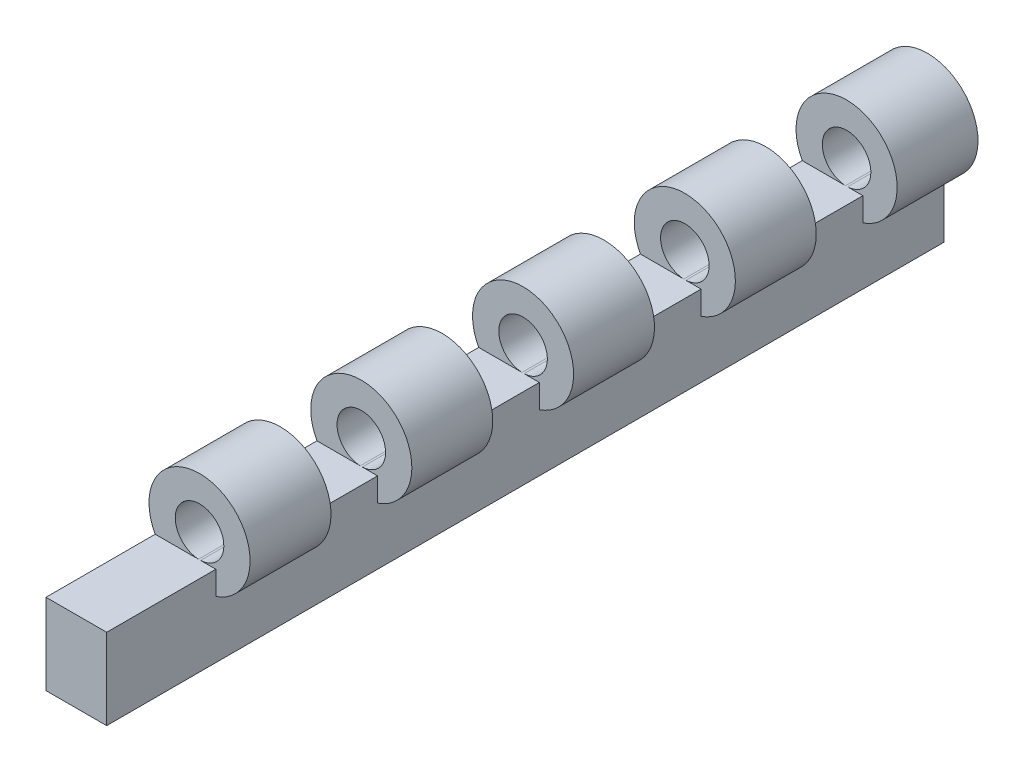
ISO-10303-21;
HEADER;
FILE_DESCRIPTION(('STEP AP214'),'2;1');
FILE_NAME('part.step','',(''),(''),'','','');
FILE_SCHEMA(('AUTOMOTIVE_DESIGN { 1 0 10303 214 1 1 1 1 }'));
ENDSEC;
DATA;
#1=APPLICATION_CONTEXT('core data for automotive mechanical design processes');
#2=APPLICATION_PROTOCOL_DEFINITION('international standard','automotive_design',2000,#1);
#3=PRODUCT_CONTEXT('',#1,'mechanical');
#4=PRODUCT('Part','Part','',(#3));
#5=PRODUCT_RELATED_PRODUCT_CATEGORY('part','',(#4));
#6=PRODUCT_DEFINITION_FORMATION('','',#4);
#7=PRODUCT_DEFINITION_CONTEXT('part definition',#1,'design');
#8=PRODUCT_DEFINITION('design','',#6,#7);
#9=PRODUCT_DEFINITION_SHAPE('','',#8);
#10=(LENGTH_UNIT() NAMED_UNIT(*) SI_UNIT(.MILLI.,.METRE.));
#11=(NAMED_UNIT(*) PLANE_ANGLE_UNIT() SI_UNIT($,.RADIAN.));
#12=(NAMED_UNIT(*) SI_UNIT($,.STERADIAN.) SOLID_ANGLE_UNIT());
#13=UNCERTAINTY_MEASURE_WITH_UNIT(LENGTH_MEASURE(1.E-05),#10,'distance_accuracy_value','');
#14=(GEOMETRIC_REPRESENTATION_CONTEXT(3) GLOBAL_UNCERTAINTY_ASSIGNED_CONTEXT((#13)) GLOBAL_UNIT_ASSIGNED_CONTEXT((#10,
#11,#12)) REPRESENTATION_CONTEXT('',''));
#15=CARTESIAN_POINT('',(0.,0.,0.));
#16=DIRECTION('',(0.,0.,1.));
#17=DIRECTION('',(1.,0.,0.));
#18=AXIS2_PLACEMENT_3D('',#15,#16,#17);
#19=CARTESIAN_POINT('',(0.,20.,0.));
#20=DIRECTION('',(0.,1.,0.));
#21=DIRECTION('',(0.,0.,-1.));
#22=AXIS2_PLACEMENT_3D('',#19,#20,#21);
#23=PLANE('',#22);
#24=DIRECTION('',(0.,0.,-1.));
#25=VECTOR('',#24,1.);
#26=CARTESIAN_POINT('',(0.,20.,103.5));
#27=LINE('',#26,#25);
#28=CARTESIAN_POINT('',(0.,20.,103.5));
#29=VERTEX_POINT('',#28);
#30=CARTESIAN_POINT('',(0.,20.,76.5));
#31=VERTEX_POINT('',#30);
#32=EDGE_CURVE('E274',#29,#31,#27,.T.);
#33=ORIENTED_EDGE('',*,*,#32,.F.);
#34=DIRECTION('',(-1.,0.,0.));
#35=VECTOR('',#34,1.);
#36=CARTESIAN_POINT('',(0.,20.,103.5));
#37=LINE('',#36,#35);
#38=CARTESIAN_POINT('',(15.,20.,103.5));
#39=VERTEX_POINT('',#38);
#40=EDGE_CURVE('E292',#39,#29,#37,.T.);
#41=ORIENTED_EDGE('',*,*,#40,.F.);
#42=DIRECTION('',(0.,0.,1.));
#43=VECTOR('',#42,1.);
#44=CARTESIAN_POINT('',(15.,20.,103.5));
#45=LINE('',#44,#43);
#46=CARTESIAN_POINT('',(15.,20.,76.5));
#47=VERTEX_POINT('',#46);
#48=EDGE_CURVE('E277',#47,#39,#45,.T.);
#49=ORIENTED_EDGE('',*,*,#48,.F.);
#50=DIRECTION('',(1.,0.,0.));
#51=VECTOR('',#50,1.);
#52=CARTESIAN_POINT('',(0.,20.,76.5));
#53=LINE('',#52,#51);
#54=CARTESIAN_POINT('',(11.2318391123888,20.,76.5));
#55=VERTEX_POINT('',#54);
#56=EDGE_CURVE('E233',#55,#47,#53,.T.);
#57=ORIENTED_EDGE('',*,*,#56,.F.);
#58=DIRECTION('',(0.,0.,-1.));
#59=VECTOR('',#58,1.);
#60=CARTESIAN_POINT('',(11.2318391123888,20.,76.5));
#61=LINE('',#60,#59);
#62=CARTESIAN_POINT('',(11.2318391123888,20.,56.5));
#63=VERTEX_POINT('',#62);
#64=EDGE_CURVE('E43',#63,#55,#61,.F.);
#65=ORIENTED_EDGE('',*,*,#64,.F.);
#66=DIRECTION('',(1.,0.,0.));
#67=VECTOR('',#66,1.);
#68=CARTESIAN_POINT('',(0.,20.,56.5));
#69=LINE('',#68,#67);
#70=CARTESIAN_POINT('',(15.,20.,56.5));
#71=VERTEX_POINT('',#70);
#72=EDGE_CURVE('E221',#63,#71,#69,.T.);
#73=ORIENTED_EDGE('',*,*,#72,.T.);
#74=CARTESIAN_POINT('',(15.,20.,36.5));
#75=VERTEX_POINT('',#74);
#76=EDGE_CURVE('E415',#75,#71,#45,.T.);
#77=ORIENTED_EDGE('',*,*,#76,.F.);
#78=DIRECTION('',(1.,0.,0.));
#79=VECTOR('',#78,1.);
#80=CARTESIAN_POINT('',(0.,20.,36.5));
#81=LINE('',#80,#79);
#82=CARTESIAN_POINT('',(11.2318391123888,20.,36.5));
#83=VERTEX_POINT('',#82);
#84=EDGE_CURVE('E366',#83,#75,#81,.T.);
#85=ORIENTED_EDGE('',*,*,#84,.F.);
#86=DIRECTION('',(0.,0.,-1.));
#87=VECTOR('',#86,1.);
#88=CARTESIAN_POINT('',(11.2318391123888,20.,36.5));
#89=LINE('',#88,#87);
#90=CARTESIAN_POINT('',(11.2318391123888,20.,16.5));
#91=VERTEX_POINT('',#90);
#92=EDGE_CURVE('E236',#91,#83,#89,.F.);
#93=ORIENTED_EDGE('',*,*,#92,.F.);
#94=DIRECTION('',(1.,0.,0.));
#95=VECTOR('',#94,1.);
#96=CARTESIAN_POINT('',(0.,20.,16.5));
#97=LINE('',#96,#95);
#98=CARTESIAN_POINT('',(15.,20.,16.5));
#99=VERTEX_POINT('',#98);
#100=EDGE_CURVE('E372',#91,#99,#97,.T.);
#101=ORIENTED_EDGE('',*,*,#100,.T.);
#102=CARTESIAN_POINT('',(15.,20.,-3.49999999999999));
#103=VERTEX_POINT('',#102);
#104=EDGE_CURVE('E416',#103,#99,#45,.T.);
#105=ORIENTED_EDGE('',*,*,#104,.F.);
#106=DIRECTION('',(1.,0.,0.));
#107=VECTOR('',#106,1.);
#108=CARTESIAN_POINT('',(0.,20.,-3.49999999999999));
#109=LINE('',#108,#107);
#110=CARTESIAN_POINT('',(11.2318391123888,20.,-3.49999999999999));
#111=VERTEX_POINT('',#110);
#112=EDGE_CURVE('E343',#111,#103,#109,.T.);
#113=ORIENTED_EDGE('',*,*,#112,.F.);
#114=DIRECTION('',(0.,0.,-1.));
#115=VECTOR('',#114,1.);
#116=CARTESIAN_POINT('',(11.2318391123888,20.,-3.49999999999999));
#117=LINE('',#116,#115);
#118=CARTESIAN_POINT('',(11.2318391123888,20.,-23.5));
#119=VERTEX_POINT('',#118);
#120=EDGE_CURVE('E244',#119,#111,#117,.F.);
#121=ORIENTED_EDGE('',*,*,#120,.F.);
#122=DIRECTION('',(1.,0.,0.));
#123=VECTOR('',#122,1.);
#124=CARTESIAN_POINT('',(0.,20.,-23.5));
#125=LINE('',#124,#123);
#126=CARTESIAN_POINT('',(15.,20.,-23.5));
#127=VERTEX_POINT('',#126);
#128=EDGE_CURVE('E349',#119,#127,#125,.T.);
#129=ORIENTED_EDGE('',*,*,#128,.T.);
#130=CARTESIAN_POINT('',(15.,20.,-43.5));
#131=VERTEX_POINT('',#130);
#132=EDGE_CURVE('E298',#131,#127,#45,.T.);
#133=ORIENTED_EDGE('',*,*,#132,.F.);
#134=DIRECTION('',(1.,0.,0.));
#135=VECTOR('',#134,1.);
#136=CARTESIAN_POINT('',(0.,20.,-43.5));
#137=LINE('',#136,#135);
#138=CARTESIAN_POINT('',(11.2318391123888,20.,-43.5));
#139=VERTEX_POINT('',#138);
#140=EDGE_CURVE('E320',#139,#131,#137,.T.);
#141=ORIENTED_EDGE('',*,*,#140,.F.);
#142=DIRECTION('',(0.,0.,-1.));
#143=VECTOR('',#142,1.);
#144=CARTESIAN_POINT('',(11.2318391123888,20.,-43.5));
#145=LINE('',#144,#143);
#146=CARTESIAN_POINT('',(11.2318391123888,20.,-63.5));
#147=VERTEX_POINT('',#146);
#148=EDGE_CURVE('E250',#147,#139,#145,.F.);
#149=ORIENTED_EDGE('',*,*,#148,.F.);
#150=DIRECTION('',(1.,0.,0.));
#151=VECTOR('',#150,1.);
#152=CARTESIAN_POINT('',(0.,20.,-63.5));
#153=LINE('',#152,#151);
#154=CARTESIAN_POINT('',(15.,20.,-63.5));
#155=VERTEX_POINT('',#154);
#156=EDGE_CURVE('E326',#147,#155,#153,.T.);
#157=ORIENTED_EDGE('',*,*,#156,.T.);
#158=CARTESIAN_POINT('',(15.,20.,-83.5));
#159=VERTEX_POINT('',#158);
#160=EDGE_CURVE('E295',#159,#155,#45,.T.);
#161=ORIENTED_EDGE('',*,*,#160,.F.);
#162=DIRECTION('',(1.,0.,0.));
#163=VECTOR('',#162,1.);
#164=CARTESIAN_POINT('',(0.,20.,-83.5));
#165=LINE('',#164,#163);
#166=CARTESIAN_POINT('',(11.2318391123888,20.,-83.5));
#167=VERTEX_POINT('',#166);
#168=EDGE_CURVE('E257',#167,#159,#165,.T.);
#169=ORIENTED_EDGE('',*,*,#168,.F.);
#170=DIRECTION('',(0.,0.,-1.));
#171=VECTOR('',#170,1.);
#172=CARTESIAN_POINT('',(11.2318391123888,20.,-83.5));
#173=LINE('',#172,#171);
#174=CARTESIAN_POINT('',(11.2318391123888,20.,-103.5));
#175=VERTEX_POINT('',#174);
#176=EDGE_CURVE('E261',#175,#167,#173,.F.);
#177=ORIENTED_EDGE('',*,*,#176,.F.);
#178=DIRECTION('',(1.,0.,0.));
#179=VECTOR('',#178,1.);
#180=CARTESIAN_POINT('',(0.,20.,-103.5));
#181=LINE('',#180,#179);
#182=CARTESIAN_POINT('',(10.7061718741469,20.,-103.5));
#183=VERTEX_POINT('',#182);
#184=EDGE_CURVE('E253',#183,#175,#181,.T.);
#185=ORIENTED_EDGE('',*,*,#184,.F.);
#186=DIRECTION('',(0.,0.,-1.));
#187=VECTOR('',#186,1.);
#188=CARTESIAN_POINT('',(10.7061718741469,20.,-83.5));
#189=LINE('',#188,#187);
#190=CARTESIAN_POINT('',(10.7061718741469,20.,-83.5));
#191=VERTEX_POINT('',#190);
#192=EDGE_CURVE('E260',#191,#183,#189,.T.);
#193=ORIENTED_EDGE('',*,*,#192,.F.);
#194=CARTESIAN_POINT('',(0.,20.,-83.5));
#195=VERTEX_POINT('',#194);
#196=EDGE_CURVE('E256',#195,#191,#165,.T.);
#197=ORIENTED_EDGE('',*,*,#196,.F.);
#198=CARTESIAN_POINT('',(0.,20.,-63.5));
#199=VERTEX_POINT('',#198);
#200=EDGE_CURVE('E471',#199,#195,#27,.T.);
#201=ORIENTED_EDGE('',*,*,#200,.F.);
#202=CARTESIAN_POINT('',(10.7061718741469,20.,-63.5));
#203=VERTEX_POINT('',#202);
#204=EDGE_CURVE('E325',#199,#203,#153,.T.);
#205=ORIENTED_EDGE('',*,*,#204,.T.);
#206=DIRECTION('',(0.,0.,-1.));
#207=VECTOR('',#206,1.);
#208=CARTESIAN_POINT('',(10.7061718741469,20.,-43.5));
#209=LINE('',#208,#207);
#210=CARTESIAN_POINT('',(10.7061718741469,20.,-43.5));
#211=VERTEX_POINT('',#210);
#212=EDGE_CURVE('E247',#211,#203,#209,.T.);
#213=ORIENTED_EDGE('',*,*,#212,.F.);
#214=CARTESIAN_POINT('',(0.,20.,-43.5));
#215=VERTEX_POINT('',#214);
#216=EDGE_CURVE('E319',#215,#211,#137,.T.);
#217=ORIENTED_EDGE('',*,*,#216,.F.);
#218=CARTESIAN_POINT('',(0.,20.,-23.5));
#219=VERTEX_POINT('',#218);
#220=EDGE_CURVE('E470',#219,#215,#27,.T.);
#221=ORIENTED_EDGE('',*,*,#220,.F.);
#222=CARTESIAN_POINT('',(10.7061718741469,20.,-23.5));
#223=VERTEX_POINT('',#222);
#224=EDGE_CURVE('E348',#219,#223,#125,.T.);
#225=ORIENTED_EDGE('',*,*,#224,.T.);
#226=DIRECTION('',(0.,0.,-1.));
#227=VECTOR('',#226,1.);
#228=CARTESIAN_POINT('',(10.7061718741469,20.,-3.49999999999999));
#229=LINE('',#228,#227);
#230=CARTESIAN_POINT('',(10.7061718741469,20.,-3.49999999999999));
#231=VERTEX_POINT('',#230);
#232=EDGE_CURVE('E241',#231,#223,#229,.T.);
#233=ORIENTED_EDGE('',*,*,#232,.F.);
#234=CARTESIAN_POINT('',(0.,20.,-3.49999999999999));
#235=VERTEX_POINT('',#234);
#236=EDGE_CURVE('E342',#235,#231,#109,.T.);
#237=ORIENTED_EDGE('',*,*,#236,.F.);
#238=CARTESIAN_POINT('',(0.,20.,16.5));
#239=VERTEX_POINT('',#238);
#240=EDGE_CURVE('E408',#239,#235,#27,.T.);
#241=ORIENTED_EDGE('',*,*,#240,.F.);
#242=CARTESIAN_POINT('',(10.7061718741469,20.,16.5));
#243=VERTEX_POINT('',#242);
#244=EDGE_CURVE('E371',#239,#243,#97,.T.);
#245=ORIENTED_EDGE('',*,*,#244,.T.);
#246=DIRECTION('',(0.,0.,-1.));
#247=VECTOR('',#246,1.);
#248=CARTESIAN_POINT('',(10.7061718741469,20.,36.5));
#249=LINE('',#248,#247);
#250=CARTESIAN_POINT('',(10.7061718741469,20.,36.5));
#251=VERTEX_POINT('',#250);
#252=EDGE_CURVE('E234',#251,#243,#249,.T.);
#253=ORIENTED_EDGE('',*,*,#252,.F.);
#254=CARTESIAN_POINT('',(0.,20.,36.5));
#255=VERTEX_POINT('',#254);
#256=EDGE_CURVE('E365',#255,#251,#81,.T.);
#257=ORIENTED_EDGE('',*,*,#256,.F.);
#258=CARTESIAN_POINT('',(0.,20.,56.5));
#259=VERTEX_POINT('',#258);
#260=EDGE_CURVE('E290',#259,#255,#27,.T.);
#261=ORIENTED_EDGE('',*,*,#260,.F.);
#262=CARTESIAN_POINT('',(10.7061718741469,20.,56.5));
#263=VERTEX_POINT('',#262);
#264=EDGE_CURVE('E228',#259,#263,#69,.T.);
#265=ORIENTED_EDGE('',*,*,#264,.T.);
#266=DIRECTION('',(0.,0.,-1.));
#267=VECTOR('',#266,1.);
#268=CARTESIAN_POINT('',(10.7061718741469,20.,76.5));
#269=LINE('',#268,#267);
#270=CARTESIAN_POINT('',(10.7061718741469,20.,76.5));
#271=VERTEX_POINT('',#270);
#272=EDGE_CURVE('E11',#271,#263,#269,.T.);
#273=ORIENTED_EDGE('',*,*,#272,.F.);
#274=EDGE_CURVE('E388',#31,#271,#53,.T.);
#275=ORIENTED_EDGE('',*,*,#274,.F.);
#276=EDGE_LOOP('',(#33,#41,#49,#57,#65,#73,#77,#85,#93,#101,#105,#113,#121,#129,#133,#141,#149,
#157,#161,#169,#177,#185,#193,#197,#201,#205,#213,#217,#221,#225,#233,#237,#241,#245,#253,#257,
#261,#265,#273,#275));
#277=FACE_BOUND('',#276,.T.);
#278=ADVANCED_FACE('F35',(#277),#23,.T.);
#279=CARTESIAN_POINT('',(15.,20.,103.5));
#280=DIRECTION('',(-1.,0.,0.));
#281=DIRECTION('',(0.,0.,-1.));
#282=AXIS2_PLACEMENT_3D('',#279,#280,#281);
#283=PLANE('',#282);
#284=DIRECTION('',(0.,1.,0.));
#285=VECTOR('',#284,1.);
#286=CARTESIAN_POINT('',(15.,20.,76.5));
#287=LINE('',#286,#285);
#288=CARTESIAN_POINT('',(15.,14.1620350996849,76.5));
#289=VERTEX_POINT('',#288);
#290=EDGE_CURVE('E390',#289,#47,#287,.T.);
#291=ORIENTED_EDGE('',*,*,#290,.T.);
#292=ORIENTED_EDGE('',*,*,#48,.T.);
#293=DIRECTION('',(0.,-1.,0.));
#294=VECTOR('',#293,1.);
#295=CARTESIAN_POINT('',(15.,20.,103.5));
#296=LINE('',#295,#294);
#297=CARTESIAN_POINT('',(15.,0.,103.5));
#298=VERTEX_POINT('',#297);
#299=EDGE_CURVE('E265',#39,#298,#296,.T.);
#300=ORIENTED_EDGE('',*,*,#299,.T.);
#301=DIRECTION('',(0.,0.,1.));
#302=VECTOR('',#301,1.);
#303=CARTESIAN_POINT('',(15.,0.,103.5));
#304=LINE('',#303,#302);
#305=CARTESIAN_POINT('',(15.,0.,-103.5));
#306=VERTEX_POINT('',#305);
#307=EDGE_CURVE('E281',#306,#298,#304,.T.);
#308=ORIENTED_EDGE('',*,*,#307,.F.);
#309=DIRECTION('',(0.,-1.,0.));
#310=VECTOR('',#309,1.);
#311=CARTESIAN_POINT('',(15.,20.,-103.5));
#312=LINE('',#311,#310);
#313=CARTESIAN_POINT('',(15.,14.1620350996849,-103.5));
#314=VERTEX_POINT('',#313);
#315=EDGE_CURVE('E262',#314,#306,#312,.T.);
#316=ORIENTED_EDGE('',*,*,#315,.F.);
#317=DIRECTION('',(0.,0.,-1.));
#318=VECTOR('',#317,1.);
#319=CARTESIAN_POINT('',(15.,14.1620350996849,-83.5));
#320=LINE('',#319,#318);
#321=CARTESIAN_POINT('',(15.,14.1620350996849,-83.5));
#322=VERTEX_POINT('',#321);
#323=EDGE_CURVE('E286',#322,#314,#320,.T.);
#324=ORIENTED_EDGE('',*,*,#323,.F.);
#325=DIRECTION('',(0.,1.,0.));
#326=VECTOR('',#325,1.);
#327=CARTESIAN_POINT('',(15.,20.,-83.5));
#328=LINE('',#327,#326);
#329=EDGE_CURVE('E309',#322,#159,#328,.T.);
#330=ORIENTED_EDGE('',*,*,#329,.T.);
#331=ORIENTED_EDGE('',*,*,#160,.T.);
#332=DIRECTION('',(0.,1.,0.));
#333=VECTOR('',#332,1.);
#334=CARTESIAN_POINT('',(15.,20.,-63.5));
#335=LINE('',#334,#333);
#336=CARTESIAN_POINT('',(15.,14.1620350996849,-63.5));
#337=VERTEX_POINT('',#336);
#338=EDGE_CURVE('E329',#337,#155,#335,.T.);
#339=ORIENTED_EDGE('',*,*,#338,.F.);
#340=DIRECTION('',(0.,0.,-1.));
#341=VECTOR('',#340,1.);
#342=CARTESIAN_POINT('',(15.,14.1620350996849,-43.5));
#343=LINE('',#342,#341);
#344=CARTESIAN_POINT('',(15.,14.1620350996849,-43.5));
#345=VERTEX_POINT('',#344);
#346=EDGE_CURVE('E302',#345,#337,#343,.T.);
#347=ORIENTED_EDGE('',*,*,#346,.F.);
#348=DIRECTION('',(0.,1.,0.));
#349=VECTOR('',#348,1.);
#350=CARTESIAN_POINT('',(15.,20.,-43.5));
#351=LINE('',#350,#349);
#352=EDGE_CURVE('E323',#345,#131,#351,.T.);
#353=ORIENTED_EDGE('',*,*,#352,.T.);
#354=ORIENTED_EDGE('',*,*,#132,.T.);
#355=DIRECTION('',(0.,1.,0.));
#356=VECTOR('',#355,1.);
#357=CARTESIAN_POINT('',(15.,20.,-23.5));
#358=LINE('',#357,#356);
#359=CARTESIAN_POINT('',(15.,14.1620350996849,-23.5));
#360=VERTEX_POINT('',#359);
#361=EDGE_CURVE('E352',#360,#127,#358,.T.);
#362=ORIENTED_EDGE('',*,*,#361,.F.);
#363=DIRECTION('',(0.,0.,-1.));
#364=VECTOR('',#363,1.);
#365=CARTESIAN_POINT('',(15.,14.1620350996849,-3.49999999999999));
#366=LINE('',#365,#364);
#367=CARTESIAN_POINT('',(15.,14.1620350996849,-3.49999999999999));
#368=VERTEX_POINT('',#367);
#369=EDGE_CURVE('E338',#368,#360,#366,.T.);
#370=ORIENTED_EDGE('',*,*,#369,.F.);
#371=DIRECTION('',(0.,1.,0.));
#372=VECTOR('',#371,1.);
#373=CARTESIAN_POINT('',(15.,20.,-3.49999999999999));
#374=LINE('',#373,#372);
#375=EDGE_CURVE('E346',#368,#103,#374,.T.);
#376=ORIENTED_EDGE('',*,*,#375,.T.);
#377=ORIENTED_EDGE('',*,*,#104,.T.);
#378=DIRECTION('',(0.,1.,0.));
#379=VECTOR('',#378,1.);
#380=CARTESIAN_POINT('',(15.,20.,16.5));
#381=LINE('',#380,#379);
#382=CARTESIAN_POINT('',(15.,14.1620350996849,16.5));
#383=VERTEX_POINT('',#382);
#384=EDGE_CURVE('E375',#383,#99,#381,.T.);
#385=ORIENTED_EDGE('',*,*,#384,.F.);
#386=DIRECTION('',(0.,0.,-1.));
#387=VECTOR('',#386,1.);
#388=CARTESIAN_POINT('',(15.,14.1620350996849,36.5));
#389=LINE('',#388,#387);
#390=CARTESIAN_POINT('',(15.,14.1620350996849,36.5));
#391=VERTEX_POINT('',#390);
#392=EDGE_CURVE('E361',#391,#383,#389,.T.);
#393=ORIENTED_EDGE('',*,*,#392,.F.);
#394=DIRECTION('',(0.,1.,0.));
#395=VECTOR('',#394,1.);
#396=CARTESIAN_POINT('',(15.,20.,36.5));
#397=LINE('',#396,#395);
#398=EDGE_CURVE('E369',#391,#75,#397,.T.);
#399=ORIENTED_EDGE('',*,*,#398,.T.);
#400=ORIENTED_EDGE('',*,*,#76,.T.);
#401=DIRECTION('',(0.,1.,0.));
#402=VECTOR('',#401,1.);
#403=CARTESIAN_POINT('',(15.,20.,56.5));
#404=LINE('',#403,#402);
#405=CARTESIAN_POINT('',(15.,14.1620350996849,56.5));
#406=VERTEX_POINT('',#405);
#407=EDGE_CURVE('E224',#406,#71,#404,.T.);
#408=ORIENTED_EDGE('',*,*,#407,.F.);
#409=DIRECTION('',(0.,0.,-1.));
#410=VECTOR('',#409,1.);
#411=CARTESIAN_POINT('',(15.,14.1620350996849,76.5));
#412=LINE('',#411,#410);
#413=EDGE_CURVE('E384',#289,#406,#412,.T.);
#414=ORIENTED_EDGE('',*,*,#413,.F.);
#415=EDGE_LOOP('',(#291,#292,#300,#308,#316,#324,#330,#331,#339,#347,#353,#354,#362,#370,#376,
#377,#385,#393,#399,#400,#408,#414));
#416=FACE_BOUND('',#415,.T.);
#417=ADVANCED_FACE('F423',(#416),#283,.F.);
#418=CARTESIAN_POINT('',(15.,20.,-103.5));
#419=DIRECTION('',(0.,0.,1.));
#420=DIRECTION('',(-1.,0.,0.));
#421=AXIS2_PLACEMENT_3D('',#418,#419,#420);
#422=PLANE('',#421);
#423=ORIENTED_EDGE('',*,*,#315,.T.);
#424=DIRECTION('',(1.,0.,0.));
#425=VECTOR('',#424,1.);
#426=CARTESIAN_POINT('',(15.,0.,-103.5));
#427=LINE('',#426,#425);
#428=CARTESIAN_POINT('',(0.,0.,-103.5));
#429=VERTEX_POINT('',#428);
#430=EDGE_CURVE('E284',#429,#306,#427,.T.);
#431=ORIENTED_EDGE('',*,*,#430,.F.);
#432=DIRECTION('',(0.,-1.,0.));
#433=VECTOR('',#432,1.);
#434=CARTESIAN_POINT('',(0.,20.,-103.5));
#435=LINE('',#434,#433);
#436=CARTESIAN_POINT('',(0.,20.,-103.5));
#437=VERTEX_POINT('',#436);
#438=EDGE_CURVE('E271',#437,#429,#435,.T.);
#439=ORIENTED_EDGE('',*,*,#438,.F.);
#440=CARTESIAN_POINT('',(10.9690054932678,25.9942404430136,-103.5));
#441=DIRECTION('',(0.,0.,1.));
#442=DIRECTION('',(1.,0.,0.));
#443=AXIS2_PLACEMENT_3D('',#440,#441,#442);
#444=CIRCLE('',#443,12.5);
#445=EDGE_CURVE('E312',#314,#437,#444,.T.);
#446=ORIENTED_EDGE('',*,*,#445,.F.);
#447=EDGE_LOOP('',(#423,#431,#439,#446));
#448=FACE_BOUND('',#447,.T.);
#449=ORIENTED_EDGE('',*,*,#184,.T.);
#450=CARTESIAN_POINT('',(10.9690054932678,25.9942404430136,-103.5));
#451=DIRECTION('',(0.,0.,1.));
#452=DIRECTION('',(1.,0.,0.));
#453=AXIS2_PLACEMENT_3D('',#450,#451,#452);
#454=CIRCLE('',#453,6.);
#455=EDGE_CURVE('E299',#175,#183,#454,.T.);
#456=ORIENTED_EDGE('',*,*,#455,.T.);
#457=EDGE_LOOP('',(#449,#456));
#458=FACE_BOUND('',#457,.T.);
#459=ADVANCED_FACE('F37',(#448,#458),#422,.F.);
#460=CARTESIAN_POINT('',(0.,20.,103.5));
#461=DIRECTION('',(0.,0.,-1.));
#462=DIRECTION('',(1.,0.,0.));
#463=AXIS2_PLACEMENT_3D('',#460,#461,#462);
#464=PLANE('',#463);
#465=DIRECTION('',(-1.,0.,0.));
#466=VECTOR('',#465,1.);
#467=CARTESIAN_POINT('',(0.,0.,103.5));
#468=LINE('',#467,#466);
#469=CARTESIAN_POINT('',(0.,0.,103.5));
#470=VERTEX_POINT('',#469);
#471=EDGE_CURVE('E278',#298,#470,#468,.T.);
#472=ORIENTED_EDGE('',*,*,#471,.F.);
#473=ORIENTED_EDGE('',*,*,#299,.F.);
#474=ORIENTED_EDGE('',*,*,#40,.T.);
#475=DIRECTION('',(0.,-1.,0.));
#476=VECTOR('',#475,1.);
#477=CARTESIAN_POINT('',(0.,20.,103.5));
#478=LINE('',#477,#476);
#479=EDGE_CURVE('E268',#29,#470,#478,.T.);
#480=ORIENTED_EDGE('',*,*,#479,.T.);
#481=EDGE_LOOP('',(#472,#473,#474,#480));
#482=FACE_BOUND('',#481,.T.);
#483=ADVANCED_FACE('F412',(#482),#464,.F.);
#484=CARTESIAN_POINT('',(0.,20.,103.5));
#485=DIRECTION('',(1.,0.,0.));
#486=DIRECTION('',(0.,0.,1.));
#487=AXIS2_PLACEMENT_3D('',#484,#485,#486);
#488=PLANE('',#487);
#489=DIRECTION('',(0.,0.,-1.));
#490=VECTOR('',#489,1.);
#491=CARTESIAN_POINT('',(0.,0.,103.5));
#492=LINE('',#491,#490);
#493=EDGE_CURVE('E275',#470,#429,#492,.T.);
#494=ORIENTED_EDGE('',*,*,#493,.F.);
#495=ORIENTED_EDGE('',*,*,#479,.F.);
#496=ORIENTED_EDGE('',*,*,#32,.T.);
#497=EDGE_CURVE('E289',#31,#259,#27,.T.);
#498=ORIENTED_EDGE('',*,*,#497,.T.);
#499=ORIENTED_EDGE('',*,*,#260,.T.);
#500=EDGE_CURVE('E456',#255,#239,#27,.T.);
#501=ORIENTED_EDGE('',*,*,#500,.T.);
#502=ORIENTED_EDGE('',*,*,#240,.T.);
#503=EDGE_CURVE('E469',#235,#219,#27,.T.);
#504=ORIENTED_EDGE('',*,*,#503,.T.);
#505=ORIENTED_EDGE('',*,*,#220,.T.);
#506=EDGE_CURVE('E473',#215,#199,#27,.T.);
#507=ORIENTED_EDGE('',*,*,#506,.T.);
#508=ORIENTED_EDGE('',*,*,#200,.T.);
#509=EDGE_CURVE('E291',#195,#437,#27,.T.);
#510=ORIENTED_EDGE('',*,*,#509,.T.);
#511=ORIENTED_EDGE('',*,*,#438,.T.);
#512=EDGE_LOOP('',(#494,#495,#496,#498,#499,#501,#502,#504,#505,#507,#508,#510,#511));
#513=FACE_BOUND('',#512,.T.);
#514=ADVANCED_FACE('F410',(#513),#488,.F.);
#515=CARTESIAN_POINT('',(0.,0.,0.));
#516=DIRECTION('',(0.,1.,0.));
#517=DIRECTION('',(0.,0.,-1.));
#518=AXIS2_PLACEMENT_3D('',#515,#516,#517);
#519=PLANE('',#518);
#520=ORIENTED_EDGE('',*,*,#430,.T.);
#521=ORIENTED_EDGE('',*,*,#307,.T.);
#522=ORIENTED_EDGE('',*,*,#471,.T.);
#523=ORIENTED_EDGE('',*,*,#493,.T.);
#524=EDGE_LOOP('',(#520,#521,#522,#523));
#525=FACE_BOUND('',#524,.T.);
#526=ADVANCED_FACE('F489',(#525),#519,.F.);
#527=CARTESIAN_POINT('',(10.9690054932678,25.9942404430136,-83.5));
#528=DIRECTION('',(0.,0.,-1.));
#529=DIRECTION('',(1.,0.,0.));
#530=AXIS2_PLACEMENT_3D('',#527,#528,#529);
#531=CYLINDRICAL_SURFACE('',#530,12.5);
#532=ORIENTED_EDGE('',*,*,#323,.T.);
#533=ORIENTED_EDGE('',*,*,#445,.T.);
#534=ORIENTED_EDGE('',*,*,#509,.F.);
#535=CARTESIAN_POINT('',(10.9690054932678,25.9942404430136,-83.5));
#536=DIRECTION('',(0.,0.,1.));
#537=DIRECTION('',(1.,0.,0.));
#538=AXIS2_PLACEMENT_3D('',#535,#536,#537);
#539=CIRCLE('',#538,12.5);
#540=EDGE_CURVE('E311',#322,#195,#539,.T.);
#541=ORIENTED_EDGE('',*,*,#540,.F.);
#542=EDGE_LOOP('',(#532,#533,#534,#541));
#543=FACE_BOUND('',#542,.T.);
#544=ADVANCED_FACE('F482',(#543),#531,.T.);
#545=CARTESIAN_POINT('',(10.9690054932678,25.9942404430136,-83.5));
#546=DIRECTION('',(0.,0.,-1.));
#547=DIRECTION('',(1.,0.,0.));
#548=AXIS2_PLACEMENT_3D('',#545,#546,#547);
#549=PLANE('',#548);
#550=ORIENTED_EDGE('',*,*,#196,.T.);
#551=CARTESIAN_POINT('',(10.9690054932678,25.9942404430136,-83.5));
#552=DIRECTION('',(0.,0.,1.));
#553=DIRECTION('',(1.,0.,0.));
#554=AXIS2_PLACEMENT_3D('',#551,#552,#553);
#555=CIRCLE('',#554,6.);
#556=EDGE_CURVE('E301',#167,#191,#555,.T.);
#557=ORIENTED_EDGE('',*,*,#556,.F.);
#558=ORIENTED_EDGE('',*,*,#168,.T.);
#559=ORIENTED_EDGE('',*,*,#329,.F.);
#560=ORIENTED_EDGE('',*,*,#540,.T.);
#561=EDGE_LOOP('',(#550,#557,#558,#559,#560));
#562=FACE_BOUND('',#561,.T.);
#563=ADVANCED_FACE('F496',(#562),#549,.F.);
#564=CARTESIAN_POINT('',(10.9690054932678,25.9942404430136,-83.5));
#565=DIRECTION('',(0.,0.,-1.));
#566=DIRECTION('',(1.,0.,0.));
#567=AXIS2_PLACEMENT_3D('',#564,#565,#566);
#568=CYLINDRICAL_SURFACE('',#567,6.);
#569=ORIENTED_EDGE('',*,*,#192,.T.);
#570=ORIENTED_EDGE('',*,*,#455,.F.);
#571=ORIENTED_EDGE('',*,*,#176,.T.);
#572=ORIENTED_EDGE('',*,*,#556,.T.);
#573=EDGE_LOOP('',(#569,#570,#571,#572));
#574=FACE_BOUND('',#573,.T.);
#575=ADVANCED_FACE('F517',(#574),#568,.F.);
#576=CARTESIAN_POINT('',(10.9690054932678,25.9942404430136,-43.5));
#577=DIRECTION('',(0.,0.,-1.));
#578=DIRECTION('',(1.,0.,0.));
#579=AXIS2_PLACEMENT_3D('',#576,#577,#578);
#580=CYLINDRICAL_SURFACE('',#579,12.5);
#581=ORIENTED_EDGE('',*,*,#346,.T.);
#582=CARTESIAN_POINT('',(10.9690054932678,25.9942404430136,-63.5));
#583=DIRECTION('',(0.,0.,1.));
#584=DIRECTION('',(1.,0.,0.));
#585=AXIS2_PLACEMENT_3D('',#582,#583,#584);
#586=CIRCLE('',#585,12.5);
#587=EDGE_CURVE('E332',#337,#199,#586,.T.);
#588=ORIENTED_EDGE('',*,*,#587,.T.);
#589=ORIENTED_EDGE('',*,*,#506,.F.);
#590=CARTESIAN_POINT('',(10.9690054932678,25.9942404430136,-43.5));
#591=DIRECTION('',(0.,0.,1.));
#592=DIRECTION('',(1.,0.,0.));
#593=AXIS2_PLACEMENT_3D('',#590,#591,#592);
#594=CIRCLE('',#593,12.5);
#595=EDGE_CURVE('E331',#345,#215,#594,.T.);
#596=ORIENTED_EDGE('',*,*,#595,.F.);
#597=EDGE_LOOP('',(#581,#588,#589,#596));
#598=FACE_BOUND('',#597,.T.);
#599=ADVANCED_FACE('F504',(#598),#580,.T.);
#600=CARTESIAN_POINT('',(10.9690054932678,25.9942404430136,-43.5));
#601=DIRECTION('',(0.,0.,-1.));
#602=DIRECTION('',(1.,0.,0.));
#603=AXIS2_PLACEMENT_3D('',#600,#601,#602);
#604=PLANE('',#603);
#605=ORIENTED_EDGE('',*,*,#216,.T.);
#606=CARTESIAN_POINT('',(10.9690054932678,25.9942404430136,-43.5));
#607=DIRECTION('',(0.,0.,1.));
#608=DIRECTION('',(1.,0.,0.));
#609=AXIS2_PLACEMENT_3D('',#606,#607,#608);
#610=CIRCLE('',#609,6.);
#611=EDGE_CURVE('E334',#139,#211,#610,.T.);
#612=ORIENTED_EDGE('',*,*,#611,.F.);
#613=ORIENTED_EDGE('',*,*,#140,.T.);
#614=ORIENTED_EDGE('',*,*,#352,.F.);
#615=ORIENTED_EDGE('',*,*,#595,.T.);
#616=EDGE_LOOP('',(#605,#612,#613,#614,#615));
#617=FACE_BOUND('',#616,.T.);
#618=ADVANCED_FACE('F508',(#617),#604,.F.);
#619=CARTESIAN_POINT('',(10.9690054932678,25.9942404430136,-63.5));
#620=DIRECTION('',(0.,0.,-1.));
#621=DIRECTION('',(1.,0.,0.));
#622=AXIS2_PLACEMENT_3D('',#619,#620,#621);
#623=PLANE('',#622);
#624=ORIENTED_EDGE('',*,*,#587,.F.);
#625=ORIENTED_EDGE('',*,*,#338,.T.);
#626=ORIENTED_EDGE('',*,*,#156,.F.);
#627=CARTESIAN_POINT('',(10.9690054932678,25.9942404430136,-63.5));
#628=DIRECTION('',(0.,0.,1.));
#629=DIRECTION('',(1.,0.,0.));
#630=AXIS2_PLACEMENT_3D('',#627,#628,#629);
#631=CIRCLE('',#630,6.);
#632=EDGE_CURVE('E336',#147,#203,#631,.T.);
#633=ORIENTED_EDGE('',*,*,#632,.T.);
#634=ORIENTED_EDGE('',*,*,#204,.F.);
#635=EDGE_LOOP('',(#624,#625,#626,#633,#634));
#636=FACE_BOUND('',#635,.T.);
#637=ADVANCED_FACE('F501',(#636),#623,.T.);
#638=CARTESIAN_POINT('',(10.9690054932678,25.9942404430136,-43.5));
#639=DIRECTION('',(0.,0.,-1.));
#640=DIRECTION('',(1.,0.,0.));
#641=AXIS2_PLACEMENT_3D('',#638,#639,#640);
#642=CYLINDRICAL_SURFACE('',#641,6.);
#643=ORIENTED_EDGE('',*,*,#212,.T.);
#644=ORIENTED_EDGE('',*,*,#632,.F.);
#645=ORIENTED_EDGE('',*,*,#148,.T.);
#646=ORIENTED_EDGE('',*,*,#611,.T.);
#647=EDGE_LOOP('',(#643,#644,#645,#646));
#648=FACE_BOUND('',#647,.T.);
#649=ADVANCED_FACE('F512',(#648),#642,.F.);
#650=CARTESIAN_POINT('',(10.9690054932678,25.9942404430136,-3.49999999999999));
#651=DIRECTION('',(0.,0.,-1.));
#652=DIRECTION('',(1.,0.,0.));
#653=AXIS2_PLACEMENT_3D('',#650,#651,#652);
#654=CYLINDRICAL_SURFACE('',#653,12.5);
#655=ORIENTED_EDGE('',*,*,#369,.T.);
#656=CARTESIAN_POINT('',(10.9690054932678,25.9942404430136,-23.5));
#657=DIRECTION('',(0.,0.,1.));
#658=DIRECTION('',(1.,0.,0.));
#659=AXIS2_PLACEMENT_3D('',#656,#657,#658);
#660=CIRCLE('',#659,12.5);
#661=EDGE_CURVE('E355',#360,#219,#660,.T.);
#662=ORIENTED_EDGE('',*,*,#661,.T.);
#663=ORIENTED_EDGE('',*,*,#503,.F.);
#664=CARTESIAN_POINT('',(10.9690054932678,25.9942404430136,-3.49999999999999));
#665=DIRECTION('',(0.,0.,1.));
#666=DIRECTION('',(1.,0.,0.));
#667=AXIS2_PLACEMENT_3D('',#664,#665,#666);
#668=CIRCLE('',#667,12.5);
#669=EDGE_CURVE('E354',#368,#235,#668,.T.);
#670=ORIENTED_EDGE('',*,*,#669,.F.);
#671=EDGE_LOOP('',(#655,#662,#663,#670));
#672=FACE_BOUND('',#671,.T.);
#673=ADVANCED_FACE('F439',(#672),#654,.T.);
#674=CARTESIAN_POINT('',(10.9690054932678,25.9942404430136,-3.49999999999999));
#675=DIRECTION('',(0.,0.,-1.));
#676=DIRECTION('',(1.,0.,0.));
#677=AXIS2_PLACEMENT_3D('',#674,#675,#676);
#678=PLANE('',#677);
#679=ORIENTED_EDGE('',*,*,#236,.T.);
#680=CARTESIAN_POINT('',(10.9690054932678,25.9942404430136,-3.49999999999999));
#681=DIRECTION('',(0.,0.,1.));
#682=DIRECTION('',(1.,0.,0.));
#683=AXIS2_PLACEMENT_3D('',#680,#681,#682);
#684=CIRCLE('',#683,6.);
#685=EDGE_CURVE('E357',#111,#231,#684,.T.);
#686=ORIENTED_EDGE('',*,*,#685,.F.);
#687=ORIENTED_EDGE('',*,*,#112,.T.);
#688=ORIENTED_EDGE('',*,*,#375,.F.);
#689=ORIENTED_EDGE('',*,*,#669,.T.);
#690=EDGE_LOOP('',(#679,#686,#687,#688,#689));
#691=FACE_BOUND('',#690,.T.);
#692=ADVANCED_FACE('F443',(#691),#678,.F.);
#693=CARTESIAN_POINT('',(10.9690054932678,25.9942404430136,-23.5));
#694=DIRECTION('',(0.,0.,-1.));
#695=DIRECTION('',(1.,0.,0.));
#696=AXIS2_PLACEMENT_3D('',#693,#694,#695);
#697=PLANE('',#696);
#698=ORIENTED_EDGE('',*,*,#661,.F.);
#699=ORIENTED_EDGE('',*,*,#361,.T.);
#700=ORIENTED_EDGE('',*,*,#128,.F.);
#701=CARTESIAN_POINT('',(10.9690054932678,25.9942404430136,-23.5));
#702=DIRECTION('',(0.,0.,1.));
#703=DIRECTION('',(1.,0.,0.));
#704=AXIS2_PLACEMENT_3D('',#701,#702,#703);
#705=CIRCLE('',#704,6.);
#706=EDGE_CURVE('E359',#119,#223,#705,.T.);
#707=ORIENTED_EDGE('',*,*,#706,.T.);
#708=ORIENTED_EDGE('',*,*,#224,.F.);
#709=EDGE_LOOP('',(#698,#699,#700,#707,#708));
#710=FACE_BOUND('',#709,.T.);
#711=ADVANCED_FACE('F432',(#710),#697,.T.);
#712=CARTESIAN_POINT('',(10.9690054932678,25.9942404430136,-3.49999999999999));
#713=DIRECTION('',(0.,0.,-1.));
#714=DIRECTION('',(1.,0.,0.));
#715=AXIS2_PLACEMENT_3D('',#712,#713,#714);
#716=CYLINDRICAL_SURFACE('',#715,6.);
#717=ORIENTED_EDGE('',*,*,#232,.T.);
#718=ORIENTED_EDGE('',*,*,#706,.F.);
#719=ORIENTED_EDGE('',*,*,#120,.T.);
#720=ORIENTED_EDGE('',*,*,#685,.T.);
#721=EDGE_LOOP('',(#717,#718,#719,#720));
#722=FACE_BOUND('',#721,.T.);
#723=ADVANCED_FACE('F600',(#722),#716,.F.);
#724=CARTESIAN_POINT('',(10.9690054932678,25.9942404430136,36.5));
#725=DIRECTION('',(0.,0.,-1.));
#726=DIRECTION('',(1.,0.,0.));
#727=AXIS2_PLACEMENT_3D('',#724,#725,#726);
#728=CYLINDRICAL_SURFACE('',#727,12.5);
#729=ORIENTED_EDGE('',*,*,#392,.T.);
#730=CARTESIAN_POINT('',(10.9690054932678,25.9942404430136,16.5));
#731=DIRECTION('',(0.,0.,1.));
#732=DIRECTION('',(1.,0.,0.));
#733=AXIS2_PLACEMENT_3D('',#730,#731,#732);
#734=CIRCLE('',#733,12.5);
#735=EDGE_CURVE('E378',#383,#239,#734,.T.);
#736=ORIENTED_EDGE('',*,*,#735,.T.);
#737=ORIENTED_EDGE('',*,*,#500,.F.);
#738=CARTESIAN_POINT('',(10.9690054932678,25.9942404430136,36.5));
#739=DIRECTION('',(0.,0.,1.));
#740=DIRECTION('',(1.,0.,0.));
#741=AXIS2_PLACEMENT_3D('',#738,#739,#740);
#742=CIRCLE('',#741,12.5);
#743=EDGE_CURVE('E377',#391,#255,#742,.T.);
#744=ORIENTED_EDGE('',*,*,#743,.F.);
#745=EDGE_LOOP('',(#729,#736,#737,#744));
#746=FACE_BOUND('',#745,.T.);
#747=ADVANCED_FACE('F453',(#746),#728,.T.);
#748=CARTESIAN_POINT('',(10.9690054932678,25.9942404430136,36.5));
#749=DIRECTION('',(0.,0.,-1.));
#750=DIRECTION('',(1.,0.,0.));
#751=AXIS2_PLACEMENT_3D('',#748,#749,#750);
#752=PLANE('',#751);
#753=ORIENTED_EDGE('',*,*,#256,.T.);
#754=CARTESIAN_POINT('',(10.9690054932678,25.9942404430136,36.5));
#755=DIRECTION('',(0.,0.,1.));
#756=DIRECTION('',(1.,0.,0.));
#757=AXIS2_PLACEMENT_3D('',#754,#755,#756);
#758=CIRCLE('',#757,6.);
#759=EDGE_CURVE('E380',#83,#251,#758,.T.);
#760=ORIENTED_EDGE('',*,*,#759,.F.);
#761=ORIENTED_EDGE('',*,*,#84,.T.);
#762=ORIENTED_EDGE('',*,*,#398,.F.);
#763=ORIENTED_EDGE('',*,*,#743,.T.);
#764=EDGE_LOOP('',(#753,#760,#761,#762,#763));
#765=FACE_BOUND('',#764,.T.);
#766=ADVANCED_FACE('F459',(#765),#752,.F.);
#767=CARTESIAN_POINT('',(10.9690054932678,25.9942404430136,16.5));
#768=DIRECTION('',(0.,0.,-1.));
#769=DIRECTION('',(1.,0.,0.));
#770=AXIS2_PLACEMENT_3D('',#767,#768,#769);
#771=PLANE('',#770);
#772=ORIENTED_EDGE('',*,*,#735,.F.);
#773=ORIENTED_EDGE('',*,*,#384,.T.);
#774=ORIENTED_EDGE('',*,*,#100,.F.);
#775=CARTESIAN_POINT('',(10.9690054932678,25.9942404430136,16.5));
#776=DIRECTION('',(0.,0.,1.));
#777=DIRECTION('',(1.,0.,0.));
#778=AXIS2_PLACEMENT_3D('',#775,#776,#777);
#779=CIRCLE('',#778,6.);
#780=EDGE_CURVE('E382',#91,#243,#779,.T.);
#781=ORIENTED_EDGE('',*,*,#780,.T.);
#782=ORIENTED_EDGE('',*,*,#244,.F.);
#783=EDGE_LOOP('',(#772,#773,#774,#781,#782));
#784=FACE_BOUND('',#783,.T.);
#785=ADVANCED_FACE('F448',(#784),#771,.T.);
#786=CARTESIAN_POINT('',(10.9690054932678,25.9942404430136,36.5));
#787=DIRECTION('',(0.,0.,-1.));
#788=DIRECTION('',(1.,0.,0.));
#789=AXIS2_PLACEMENT_3D('',#786,#787,#788);
#790=CYLINDRICAL_SURFACE('',#789,6.);
#791=ORIENTED_EDGE('',*,*,#252,.T.);
#792=ORIENTED_EDGE('',*,*,#780,.F.);
#793=ORIENTED_EDGE('',*,*,#92,.T.);
#794=ORIENTED_EDGE('',*,*,#759,.T.);
#795=EDGE_LOOP('',(#791,#792,#793,#794));
#796=FACE_BOUND('',#795,.T.);
#797=ADVANCED_FACE('F463',(#796),#790,.F.);
#798=CARTESIAN_POINT('',(10.9690054932678,25.9942404430136,76.5));
#799=DIRECTION('',(0.,0.,-1.));
#800=DIRECTION('',(1.,0.,0.));
#801=AXIS2_PLACEMENT_3D('',#798,#799,#800);
#802=CYLINDRICAL_SURFACE('',#801,12.5);
#803=ORIENTED_EDGE('',*,*,#413,.T.);
#804=CARTESIAN_POINT('',(10.9690054932678,25.9942404430136,56.5));
#805=DIRECTION('',(0.,0.,1.));
#806=DIRECTION('',(1.,0.,0.));
#807=AXIS2_PLACEMENT_3D('',#804,#805,#806);
#808=CIRCLE('',#807,12.5);
#809=EDGE_CURVE('E394',#406,#259,#808,.T.);
#810=ORIENTED_EDGE('',*,*,#809,.T.);
#811=ORIENTED_EDGE('',*,*,#497,.F.);
#812=CARTESIAN_POINT('',(10.9690054932678,25.9942404430136,76.5));
#813=DIRECTION('',(0.,0.,1.));
#814=DIRECTION('',(1.,0.,0.));
#815=AXIS2_PLACEMENT_3D('',#812,#813,#814);
#816=CIRCLE('',#815,12.5);
#817=EDGE_CURVE('E393',#289,#31,#816,.T.);
#818=ORIENTED_EDGE('',*,*,#817,.F.);
#819=EDGE_LOOP('',(#803,#810,#811,#818));
#820=FACE_BOUND('',#819,.T.);
#821=ADVANCED_FACE('F405',(#820),#802,.T.);
#822=CARTESIAN_POINT('',(10.9690054932678,25.9942404430136,76.5));
#823=DIRECTION('',(0.,0.,-1.));
#824=DIRECTION('',(1.,0.,0.));
#825=AXIS2_PLACEMENT_3D('',#822,#823,#824);
#826=PLANE('',#825);
#827=ORIENTED_EDGE('',*,*,#274,.T.);
#828=CARTESIAN_POINT('',(10.9690054932678,25.9942404430136,76.5));
#829=DIRECTION('',(0.,0.,1.));
#830=DIRECTION('',(1.,0.,0.));
#831=AXIS2_PLACEMENT_3D('',#828,#829,#830);
#832=CIRCLE('',#831,6.);
#833=EDGE_CURVE('E56',#55,#271,#832,.T.);
#834=ORIENTED_EDGE('',*,*,#833,.F.);
#835=ORIENTED_EDGE('',*,*,#56,.T.);
#836=ORIENTED_EDGE('',*,*,#290,.F.);
#837=ORIENTED_EDGE('',*,*,#817,.T.);
#838=EDGE_LOOP('',(#827,#834,#835,#836,#837));
#839=FACE_BOUND('',#838,.T.);
#840=ADVANCED_FACE('F400',(#839),#826,.F.);
#841=CARTESIAN_POINT('',(10.9690054932678,25.9942404430136,56.5));
#842=DIRECTION('',(0.,0.,-1.));
#843=DIRECTION('',(1.,0.,0.));
#844=AXIS2_PLACEMENT_3D('',#841,#842,#843);
#845=PLANE('',#844);
#846=ORIENTED_EDGE('',*,*,#809,.F.);
#847=ORIENTED_EDGE('',*,*,#407,.T.);
#848=ORIENTED_EDGE('',*,*,#72,.F.);
#849=CARTESIAN_POINT('',(10.9690054932678,25.9942404430136,56.5));
#850=DIRECTION('',(0.,0.,1.));
#851=DIRECTION('',(1.,0.,0.));
#852=AXIS2_PLACEMENT_3D('',#849,#850,#851);
#853=CIRCLE('',#852,6.);
#854=EDGE_CURVE('E50',#63,#263,#853,.T.);
#855=ORIENTED_EDGE('',*,*,#854,.T.);
#856=ORIENTED_EDGE('',*,*,#264,.F.);
#857=EDGE_LOOP('',(#846,#847,#848,#855,#856));
#858=FACE_BOUND('',#857,.T.);
#859=ADVANCED_FACE('F222',(#858),#845,.T.);
#860=CARTESIAN_POINT('',(10.9690054932678,25.9942404430136,76.5));
#861=DIRECTION('',(0.,0.,-1.));
#862=DIRECTION('',(1.,0.,0.));
#863=AXIS2_PLACEMENT_3D('',#860,#861,#862);
#864=CYLINDRICAL_SURFACE('',#863,6.);
#865=ORIENTED_EDGE('',*,*,#272,.T.);
#866=ORIENTED_EDGE('',*,*,#854,.F.);
#867=ORIENTED_EDGE('',*,*,#64,.T.);
#868=ORIENTED_EDGE('',*,*,#833,.T.);
#869=EDGE_LOOP('',(#865,#866,#867,#868));
#870=FACE_BOUND('',#869,.T.);
#871=ADVANCED_FACE('F214',(#870),#864,.F.);
#872=CLOSED_SHELL('',(#278,#417,#459,#483,#514,#526,#544,#563,#575,#599,#618,#637,#649,#673,
#692,#711,#723,#747,#766,#785,#797,#821,#840,#859,#871));
#873=MANIFOLD_SOLID_BREP('B2',#872);
#874=ADVANCED_BREP_SHAPE_REPRESENTATION('',(#18,#873),#14);
#875=SHAPE_DEFINITION_REPRESENTATION(#9,#874);
ENDSEC;
END-ISO-10303-21;
